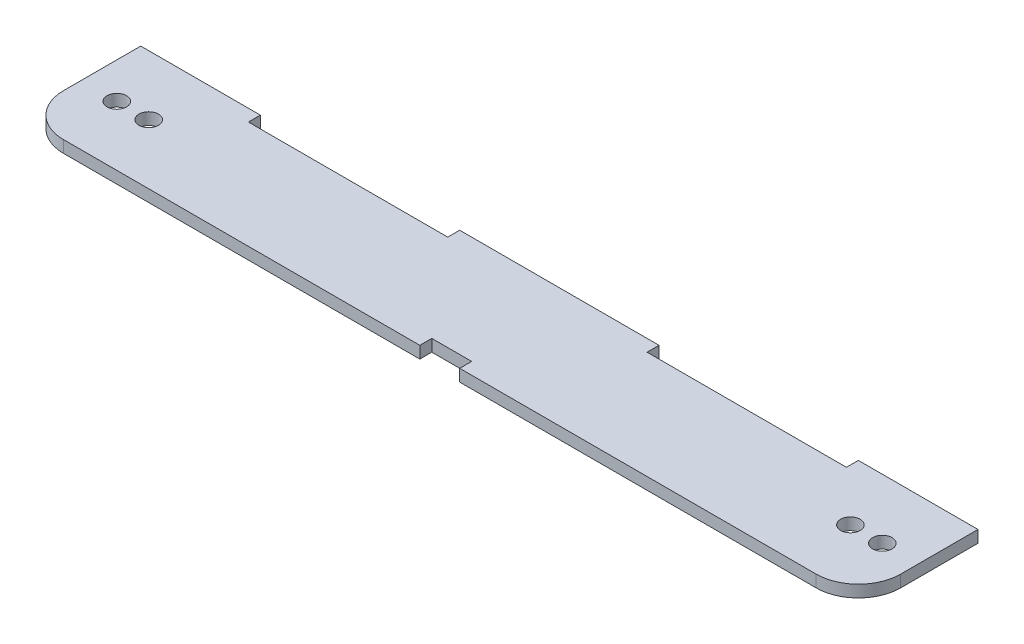
ISO-10303-21;
HEADER;
FILE_DESCRIPTION(('STEP AP214'),'2;1');
FILE_NAME('part.step','',(''),(''),'','','');
FILE_SCHEMA(('AUTOMOTIVE_DESIGN { 1 0 10303 214 1 1 1 1 }'));
ENDSEC;
DATA;
#1=APPLICATION_CONTEXT('core data for automotive mechanical design processes');
#2=APPLICATION_PROTOCOL_DEFINITION('international standard','automotive_design',2000,#1);
#3=PRODUCT_CONTEXT('',#1,'mechanical');
#4=PRODUCT('Part','Part','',(#3));
#5=PRODUCT_RELATED_PRODUCT_CATEGORY('part','',(#4));
#6=PRODUCT_DEFINITION_FORMATION('','',#4);
#7=PRODUCT_DEFINITION_CONTEXT('part definition',#1,'design');
#8=PRODUCT_DEFINITION('design','',#6,#7);
#9=PRODUCT_DEFINITION_SHAPE('','',#8);
#10=(LENGTH_UNIT() NAMED_UNIT(*) SI_UNIT(.MILLI.,.METRE.));
#11=(NAMED_UNIT(*) PLANE_ANGLE_UNIT() SI_UNIT($,.RADIAN.));
#12=(NAMED_UNIT(*) SI_UNIT($,.STERADIAN.) SOLID_ANGLE_UNIT());
#13=UNCERTAINTY_MEASURE_WITH_UNIT(LENGTH_MEASURE(1.E-05),#10,'distance_accuracy_value','');
#14=(GEOMETRIC_REPRESENTATION_CONTEXT(3) GLOBAL_UNCERTAINTY_ASSIGNED_CONTEXT((#13)) GLOBAL_UNIT_ASSIGNED_CONTEXT((#10,
#11,#12)) REPRESENTATION_CONTEXT('',''));
#15=CARTESIAN_POINT('',(0.,0.,0.));
#16=DIRECTION('',(0.,0.,1.));
#17=DIRECTION('',(1.,0.,0.));
#18=AXIS2_PLACEMENT_3D('',#15,#16,#17);
#19=CARTESIAN_POINT('',(105.,3.,15.));
#20=DIRECTION('',(0.,0.,-1.));
#21=DIRECTION('',(-1.,0.,0.));
#22=AXIS2_PLACEMENT_3D('',#19,#20,#21);
#23=PLANE('',#22);
#24=DIRECTION('',(0.,-1.,0.));
#25=VECTOR('',#24,1.);
#26=CARTESIAN_POINT('',(94.3933982822018,3.,15.));
#27=LINE('',#26,#25);
#28=CARTESIAN_POINT('',(94.3933982822018,3.,15.));
#29=VERTEX_POINT('',#28);
#30=CARTESIAN_POINT('',(94.3933982822018,0.,15.));
#31=VERTEX_POINT('',#30);
#32=EDGE_CURVE('E62',#29,#31,#27,.T.);
#33=ORIENTED_EDGE('',*,*,#32,.F.);
#34=DIRECTION('',(1.,0.,0.));
#35=VECTOR('',#34,1.);
#36=CARTESIAN_POINT('',(105.,3.,15.));
#37=LINE('',#36,#35);
#38=CARTESIAN_POINT('',(5.,3.,15.));
#39=VERTEX_POINT('',#38);
#40=EDGE_CURVE('E236',#39,#29,#37,.T.);
#41=ORIENTED_EDGE('',*,*,#40,.F.);
#42=DIRECTION('',(0.,-1.,0.));
#43=VECTOR('',#42,1.);
#44=CARTESIAN_POINT('',(5.,3.,15.));
#45=LINE('',#44,#43);
#46=CARTESIAN_POINT('',(5.,0.,15.));
#47=VERTEX_POINT('',#46);
#48=EDGE_CURVE('E206',#39,#47,#45,.T.);
#49=ORIENTED_EDGE('',*,*,#48,.T.);
#50=DIRECTION('',(1.,0.,0.));
#51=VECTOR('',#50,1.);
#52=CARTESIAN_POINT('',(105.,0.,15.));
#53=LINE('',#52,#51);
#54=EDGE_CURVE('E250',#47,#31,#53,.T.);
#55=ORIENTED_EDGE('',*,*,#54,.T.);
#56=EDGE_LOOP('',(#33,#41,#49,#55));
#57=FACE_BOUND('',#56,.T.);
#58=ADVANCED_FACE('F39',(#57),#23,.F.);
#59=DIRECTION('',(0.,-1.,0.));
#60=VECTOR('',#59,1.);
#61=CARTESIAN_POINT('',(-94.3933982822018,3.,15.));
#62=LINE('',#61,#60);
#63=CARTESIAN_POINT('',(-94.3933982822018,3.,15.));
#64=VERTEX_POINT('',#63);
#65=CARTESIAN_POINT('',(-94.3933982822018,0.,15.));
#66=VERTEX_POINT('',#65);
#67=EDGE_CURVE('E77',#64,#66,#62,.T.);
#68=ORIENTED_EDGE('',*,*,#67,.T.);
#69=CARTESIAN_POINT('',(-5.,0.,15.));
#70=VERTEX_POINT('',#69);
#71=EDGE_CURVE('E253',#66,#70,#53,.T.);
#72=ORIENTED_EDGE('',*,*,#71,.T.);
#73=DIRECTION('',(0.,-1.,0.));
#74=VECTOR('',#73,1.);
#75=CARTESIAN_POINT('',(-5.,3.,15.));
#76=LINE('',#75,#74);
#77=CARTESIAN_POINT('',(-5.,3.,15.));
#78=VERTEX_POINT('',#77);
#79=EDGE_CURVE('E335',#78,#70,#76,.T.);
#80=ORIENTED_EDGE('',*,*,#79,.F.);
#81=EDGE_CURVE('E238',#64,#78,#37,.T.);
#82=ORIENTED_EDGE('',*,*,#81,.F.);
#83=EDGE_LOOP('',(#68,#72,#80,#82));
#84=FACE_BOUND('',#83,.T.);
#85=ADVANCED_FACE('F356',(#84),#23,.F.);
#86=CARTESIAN_POINT('',(0.,3.,0.));
#87=DIRECTION('',(0.,1.,0.));
#88=DIRECTION('',(0.,0.,1.));
#89=AXIS2_PLACEMENT_3D('',#86,#87,#88);
#90=PLANE('',#89);
#91=CARTESIAN_POINT('',(-94.3933982822018,3.,4.39339828220181));
#92=DIRECTION('',(0.,1.,0.));
#93=DIRECTION('',(0.,0.,1.));
#94=AXIS2_PLACEMENT_3D('',#91,#92,#93);
#95=CIRCLE('',#94,10.6066017177982);
#96=CARTESIAN_POINT('',(-105.,3.,4.39339828220181));
#97=VERTEX_POINT('',#96);
#98=EDGE_CURVE('E312',#97,#64,#95,.T.);
#99=ORIENTED_EDGE('',*,*,#98,.T.);
#100=ORIENTED_EDGE('',*,*,#81,.T.);
#101=DIRECTION('',(0.,0.,-1.));
#102=VECTOR('',#101,1.);
#103=CARTESIAN_POINT('',(-5.,3.,12.));
#104=LINE('',#103,#102);
#105=CARTESIAN_POINT('',(-5.,3.,12.));
#106=VERTEX_POINT('',#105);
#107=EDGE_CURVE('E286',#78,#106,#104,.T.);
#108=ORIENTED_EDGE('',*,*,#107,.T.);
#109=DIRECTION('',(1.,0.,0.));
#110=VECTOR('',#109,1.);
#111=CARTESIAN_POINT('',(5.,3.,12.));
#112=LINE('',#111,#110);
#113=CARTESIAN_POINT('',(5.,3.,12.));
#114=VERTEX_POINT('',#113);
#115=EDGE_CURVE('E330',#106,#114,#112,.T.);
#116=ORIENTED_EDGE('',*,*,#115,.T.);
#117=DIRECTION('',(0.,0.,1.));
#118=VECTOR('',#117,1.);
#119=CARTESIAN_POINT('',(5.,3.,15.));
#120=LINE('',#119,#118);
#121=EDGE_CURVE('E333',#114,#39,#120,.T.);
#122=ORIENTED_EDGE('',*,*,#121,.T.);
#123=ORIENTED_EDGE('',*,*,#40,.T.);
#124=CARTESIAN_POINT('',(94.3933982822018,3.,4.39339828220175));
#125=DIRECTION('',(0.,-1.,0.));
#126=DIRECTION('',(0.,0.,-1.));
#127=AXIS2_PLACEMENT_3D('',#124,#125,#126);
#128=CIRCLE('',#127,10.6066017177982);
#129=CARTESIAN_POINT('',(105.,3.,4.39339828220174));
#130=VERTEX_POINT('',#129);
#131=EDGE_CURVE('E309',#130,#29,#128,.T.);
#132=ORIENTED_EDGE('',*,*,#131,.F.);
#133=DIRECTION('',(0.,0.,-1.));
#134=VECTOR('',#133,1.);
#135=CARTESIAN_POINT('',(105.,3.,15.));
#136=LINE('',#135,#134);
#137=CARTESIAN_POINT('',(105.,3.,-15.));
#138=VERTEX_POINT('',#137);
#139=EDGE_CURVE('E240',#130,#138,#136,.T.);
#140=ORIENTED_EDGE('',*,*,#139,.T.);
#141=DIRECTION('',(-1.,0.,0.));
#142=VECTOR('',#141,1.);
#143=CARTESIAN_POINT('',(105.,3.,-15.));
#144=LINE('',#143,#142);
#145=CARTESIAN_POINT('',(75.,3.,-15.));
#146=VERTEX_POINT('',#145);
#147=EDGE_CURVE('E243',#138,#146,#144,.T.);
#148=ORIENTED_EDGE('',*,*,#147,.T.);
#149=DIRECTION('',(0.,0.,-1.));
#150=VECTOR('',#149,1.);
#151=CARTESIAN_POINT('',(75.,3.,0.));
#152=LINE('',#151,#150);
#153=CARTESIAN_POINT('',(75.,3.,-12.));
#154=VERTEX_POINT('',#153);
#155=EDGE_CURVE('E225',#154,#146,#152,.T.);
#156=ORIENTED_EDGE('',*,*,#155,.F.);
#157=DIRECTION('',(1.,0.,0.));
#158=VECTOR('',#157,1.);
#159=CARTESIAN_POINT('',(0.,3.,-12.));
#160=LINE('',#159,#158);
#161=CARTESIAN_POINT('',(25.,3.,-12.));
#162=VERTEX_POINT('',#161);
#163=EDGE_CURVE('E223',#162,#154,#160,.T.);
#164=ORIENTED_EDGE('',*,*,#163,.F.);
#165=DIRECTION('',(0.,0.,1.));
#166=VECTOR('',#165,1.);
#167=CARTESIAN_POINT('',(25.,3.,0.));
#168=LINE('',#167,#166);
#169=CARTESIAN_POINT('',(25.,3.,-15.));
#170=VERTEX_POINT('',#169);
#171=EDGE_CURVE('E199',#170,#162,#168,.T.);
#172=ORIENTED_EDGE('',*,*,#171,.F.);
#173=CARTESIAN_POINT('',(-25.,3.,-15.));
#174=VERTEX_POINT('',#173);
#175=EDGE_CURVE('E247',#170,#174,#144,.T.);
#176=ORIENTED_EDGE('',*,*,#175,.T.);
#177=DIRECTION('',(0.,0.,-1.));
#178=VECTOR('',#177,1.);
#179=CARTESIAN_POINT('',(-25.,3.,0.));
#180=LINE('',#179,#178);
#181=CARTESIAN_POINT('',(-25.,3.,-12.));
#182=VERTEX_POINT('',#181);
#183=EDGE_CURVE('E228',#182,#174,#180,.T.);
#184=ORIENTED_EDGE('',*,*,#183,.F.);
#185=DIRECTION('',(1.,0.,0.));
#186=VECTOR('',#185,1.);
#187=CARTESIAN_POINT('',(0.,3.,-12.));
#188=LINE('',#187,#186);
#189=CARTESIAN_POINT('',(-75.,3.,-12.));
#190=VERTEX_POINT('',#189);
#191=EDGE_CURVE('E186',#190,#182,#188,.T.);
#192=ORIENTED_EDGE('',*,*,#191,.F.);
#193=DIRECTION('',(0.,0.,1.));
#194=VECTOR('',#193,1.);
#195=CARTESIAN_POINT('',(-75.,3.,0.));
#196=LINE('',#195,#194);
#197=CARTESIAN_POINT('',(-75.,3.,-15.));
#198=VERTEX_POINT('',#197);
#199=EDGE_CURVE('E230',#198,#190,#196,.T.);
#200=ORIENTED_EDGE('',*,*,#199,.F.);
#201=CARTESIAN_POINT('',(-105.,3.,-15.));
#202=VERTEX_POINT('',#201);
#203=EDGE_CURVE('E242',#198,#202,#144,.T.);
#204=ORIENTED_EDGE('',*,*,#203,.T.);
#205=DIRECTION('',(0.,0.,1.));
#206=VECTOR('',#205,1.);
#207=CARTESIAN_POINT('',(-105.,3.,15.));
#208=LINE('',#207,#206);
#209=EDGE_CURVE('E233',#202,#97,#208,.T.);
#210=ORIENTED_EDGE('',*,*,#209,.T.);
#211=EDGE_LOOP('',(#99,#100,#108,#116,#122,#123,#132,#140,#148,#156,#164,#172,#176,#184,#192,
#200,#204,#210));
#212=FACE_BOUND('',#211,.T.);
#213=CARTESIAN_POINT('',(96.,3.,0.));
#214=DIRECTION('',(0.,1.,0.));
#215=DIRECTION('',(0.,0.,-1.));
#216=AXIS2_PLACEMENT_3D('',#213,#214,#215);
#217=CIRCLE('',#216,2.45);
#218=CARTESIAN_POINT('',(96.,3.,2.44999999999992));
#219=VERTEX_POINT('',#218);
#220=EDGE_CURVE('E323',#219,#219,#217,.T.);
#221=ORIENTED_EDGE('',*,*,#220,.F.);
#222=EDGE_LOOP('',(#221));
#223=FACE_BOUND('',#222,.T.);
#224=CARTESIAN_POINT('',(88.,3.,0.));
#225=DIRECTION('',(0.,1.,0.));
#226=DIRECTION('',(0.,0.,1.));
#227=AXIS2_PLACEMENT_3D('',#224,#225,#226);
#228=CIRCLE('',#227,2.45);
#229=CARTESIAN_POINT('',(88.,3.,2.44999999999993));
#230=VERTEX_POINT('',#229);
#231=EDGE_CURVE('E320',#230,#230,#228,.T.);
#232=ORIENTED_EDGE('',*,*,#231,.F.);
#233=EDGE_LOOP('',(#232));
#234=FACE_BOUND('',#233,.T.);
#235=CARTESIAN_POINT('',(-96.,3.,0.));
#236=DIRECTION('',(0.,1.,0.));
#237=DIRECTION('',(0.,0.,1.));
#238=AXIS2_PLACEMENT_3D('',#235,#236,#237);
#239=CIRCLE('',#238,2.45);
#240=CARTESIAN_POINT('',(-96.,3.,2.45));
#241=VERTEX_POINT('',#240);
#242=EDGE_CURVE('E317',#241,#241,#239,.T.);
#243=ORIENTED_EDGE('',*,*,#242,.F.);
#244=EDGE_LOOP('',(#243));
#245=FACE_BOUND('',#244,.T.);
#246=CARTESIAN_POINT('',(-88.,3.,0.));
#247=DIRECTION('',(0.,1.,0.));
#248=DIRECTION('',(0.,0.,-1.));
#249=AXIS2_PLACEMENT_3D('',#246,#247,#248);
#250=CIRCLE('',#249,2.45);
#251=CARTESIAN_POINT('',(-88.,3.,2.45));
#252=VERTEX_POINT('',#251);
#253=EDGE_CURVE('E278',#252,#252,#250,.T.);
#254=ORIENTED_EDGE('',*,*,#253,.F.);
#255=EDGE_LOOP('',(#254));
#256=FACE_BOUND('',#255,.T.);
#257=ADVANCED_FACE('F305',(#212,#223,#234,#245,#256),#90,.T.);
#258=CARTESIAN_POINT('',(0.,0.,0.));
#259=DIRECTION('',(0.,1.,0.));
#260=DIRECTION('',(0.,0.,1.));
#261=AXIS2_PLACEMENT_3D('',#258,#259,#260);
#262=PLANE('',#261);
#263=CARTESIAN_POINT('',(-88.,0.,0.));
#264=DIRECTION('',(0.,1.,0.));
#265=DIRECTION('',(0.,0.,1.));
#266=AXIS2_PLACEMENT_3D('',#263,#264,#265);
#267=CIRCLE('',#266,2.45);
#268=CARTESIAN_POINT('',(-88.,0.,2.45));
#269=VERTEX_POINT('',#268);
#270=EDGE_CURVE('E274',#269,#269,#267,.T.);
#271=ORIENTED_EDGE('',*,*,#270,.T.);
#272=EDGE_LOOP('',(#271));
#273=FACE_BOUND('',#272,.T.);
#274=CARTESIAN_POINT('',(-96.,0.,0.));
#275=DIRECTION('',(0.,1.,0.));
#276=DIRECTION('',(0.,0.,1.));
#277=AXIS2_PLACEMENT_3D('',#274,#275,#276);
#278=CIRCLE('',#277,2.45);
#279=CARTESIAN_POINT('',(-96.,0.,2.45));
#280=VERTEX_POINT('',#279);
#281=EDGE_CURVE('E277',#280,#280,#278,.T.);
#282=ORIENTED_EDGE('',*,*,#281,.T.);
#283=EDGE_LOOP('',(#282));
#284=FACE_BOUND('',#283,.T.);
#285=CARTESIAN_POINT('',(88.,0.,0.));
#286=DIRECTION('',(0.,1.,0.));
#287=DIRECTION('',(0.,0.,1.));
#288=AXIS2_PLACEMENT_3D('',#285,#286,#287);
#289=CIRCLE('',#288,2.45);
#290=CARTESIAN_POINT('',(88.,0.,2.44999999999993));
#291=VERTEX_POINT('',#290);
#292=EDGE_CURVE('E281',#291,#291,#289,.T.);
#293=ORIENTED_EDGE('',*,*,#292,.T.);
#294=EDGE_LOOP('',(#293));
#295=FACE_BOUND('',#294,.T.);
#296=CARTESIAN_POINT('',(96.,0.,0.));
#297=DIRECTION('',(0.,1.,0.));
#298=DIRECTION('',(0.,0.,1.));
#299=AXIS2_PLACEMENT_3D('',#296,#297,#298);
#300=CIRCLE('',#299,2.45);
#301=CARTESIAN_POINT('',(96.,0.,2.44999999999992));
#302=VERTEX_POINT('',#301);
#303=EDGE_CURVE('E284',#302,#302,#300,.T.);
#304=ORIENTED_EDGE('',*,*,#303,.T.);
#305=EDGE_LOOP('',(#304));
#306=FACE_BOUND('',#305,.T.);
#307=ORIENTED_EDGE('',*,*,#71,.F.);
#308=CARTESIAN_POINT('',(-94.3933982822018,0.,4.39339828220181));
#309=DIRECTION('',(0.,-1.,0.));
#310=DIRECTION('',(0.,0.,-1.));
#311=AXIS2_PLACEMENT_3D('',#308,#309,#310);
#312=CIRCLE('',#311,10.6066017177982);
#313=CARTESIAN_POINT('',(-105.,0.,4.39339828220181));
#314=VERTEX_POINT('',#313);
#315=EDGE_CURVE('E11',#66,#314,#312,.T.);
#316=ORIENTED_EDGE('',*,*,#315,.T.);
#317=DIRECTION('',(0.,0.,1.));
#318=VECTOR('',#317,1.);
#319=CARTESIAN_POINT('',(-105.,0.,15.));
#320=LINE('',#319,#318);
#321=CARTESIAN_POINT('',(-105.,0.,-15.));
#322=VERTEX_POINT('',#321);
#323=EDGE_CURVE('E232',#322,#314,#320,.T.);
#324=ORIENTED_EDGE('',*,*,#323,.F.);
#325=DIRECTION('',(-1.,0.,0.));
#326=VECTOR('',#325,1.);
#327=CARTESIAN_POINT('',(105.,0.,-15.));
#328=LINE('',#327,#326);
#329=CARTESIAN_POINT('',(-75.,0.,-15.));
#330=VERTEX_POINT('',#329);
#331=EDGE_CURVE('E256',#330,#322,#328,.T.);
#332=ORIENTED_EDGE('',*,*,#331,.F.);
#333=DIRECTION('',(0.,0.,1.));
#334=VECTOR('',#333,1.);
#335=CARTESIAN_POINT('',(-75.,0.,-15.));
#336=LINE('',#335,#334);
#337=CARTESIAN_POINT('',(-75.,0.,-12.));
#338=VERTEX_POINT('',#337);
#339=EDGE_CURVE('E191',#330,#338,#336,.T.);
#340=ORIENTED_EDGE('',*,*,#339,.T.);
#341=DIRECTION('',(1.,0.,0.));
#342=VECTOR('',#341,1.);
#343=CARTESIAN_POINT('',(-75.,0.,-12.));
#344=LINE('',#343,#342);
#345=CARTESIAN_POINT('',(-25.,0.,-12.));
#346=VERTEX_POINT('',#345);
#347=EDGE_CURVE('E178',#338,#346,#344,.T.);
#348=ORIENTED_EDGE('',*,*,#347,.T.);
#349=DIRECTION('',(0.,0.,-1.));
#350=VECTOR('',#349,1.);
#351=CARTESIAN_POINT('',(-25.,0.,-15.));
#352=LINE('',#351,#350);
#353=CARTESIAN_POINT('',(-25.,0.,-15.));
#354=VERTEX_POINT('',#353);
#355=EDGE_CURVE('E166',#346,#354,#352,.T.);
#356=ORIENTED_EDGE('',*,*,#355,.T.);
#357=CARTESIAN_POINT('',(25.,0.,-15.));
#358=VERTEX_POINT('',#357);
#359=EDGE_CURVE('E259',#358,#354,#328,.T.);
#360=ORIENTED_EDGE('',*,*,#359,.F.);
#361=DIRECTION('',(0.,0.,1.));
#362=VECTOR('',#361,1.);
#363=CARTESIAN_POINT('',(25.,0.,-15.));
#364=LINE('',#363,#362);
#365=CARTESIAN_POINT('',(25.,0.,-12.));
#366=VERTEX_POINT('',#365);
#367=EDGE_CURVE('E205',#358,#366,#364,.T.);
#368=ORIENTED_EDGE('',*,*,#367,.T.);
#369=DIRECTION('',(1.,0.,0.));
#370=VECTOR('',#369,1.);
#371=CARTESIAN_POINT('',(25.,0.,-12.));
#372=LINE('',#371,#370);
#373=CARTESIAN_POINT('',(75.,0.,-12.));
#374=VERTEX_POINT('',#373);
#375=EDGE_CURVE('E209',#366,#374,#372,.T.);
#376=ORIENTED_EDGE('',*,*,#375,.T.);
#377=DIRECTION('',(0.,0.,-1.));
#378=VECTOR('',#377,1.);
#379=CARTESIAN_POINT('',(75.,0.,-15.));
#380=LINE('',#379,#378);
#381=CARTESIAN_POINT('',(75.,0.,-15.));
#382=VERTEX_POINT('',#381);
#383=EDGE_CURVE('E202',#374,#382,#380,.T.);
#384=ORIENTED_EDGE('',*,*,#383,.T.);
#385=CARTESIAN_POINT('',(105.,0.,-15.));
#386=VERTEX_POINT('',#385);
#387=EDGE_CURVE('E237',#386,#382,#328,.T.);
#388=ORIENTED_EDGE('',*,*,#387,.F.);
#389=DIRECTION('',(0.,0.,-1.));
#390=VECTOR('',#389,1.);
#391=CARTESIAN_POINT('',(105.,0.,15.));
#392=LINE('',#391,#390);
#393=CARTESIAN_POINT('',(105.,0.,4.39339828220175));
#394=VERTEX_POINT('',#393);
#395=EDGE_CURVE('E254',#394,#386,#392,.T.);
#396=ORIENTED_EDGE('',*,*,#395,.F.);
#397=CARTESIAN_POINT('',(94.3933982822018,0.,4.39339828220175));
#398=DIRECTION('',(0.,-1.,0.));
#399=DIRECTION('',(0.,0.,-1.));
#400=AXIS2_PLACEMENT_3D('',#397,#398,#399);
#401=CIRCLE('',#400,10.6066017177982);
#402=EDGE_CURVE('E47',#31,#394,#401,.F.);
#403=ORIENTED_EDGE('',*,*,#402,.F.);
#404=ORIENTED_EDGE('',*,*,#54,.F.);
#405=DIRECTION('',(0.,0.,-1.));
#406=VECTOR('',#405,1.);
#407=CARTESIAN_POINT('',(5.,0.,0.));
#408=LINE('',#407,#406);
#409=CARTESIAN_POINT('',(5.,0.,12.));
#410=VERTEX_POINT('',#409);
#411=EDGE_CURVE('E271',#47,#410,#408,.T.);
#412=ORIENTED_EDGE('',*,*,#411,.T.);
#413=DIRECTION('',(-1.,0.,0.));
#414=VECTOR('',#413,1.);
#415=CARTESIAN_POINT('',(0.,0.,12.));
#416=LINE('',#415,#414);
#417=CARTESIAN_POINT('',(-5.,0.,12.));
#418=VERTEX_POINT('',#417);
#419=EDGE_CURVE('E268',#410,#418,#416,.T.);
#420=ORIENTED_EDGE('',*,*,#419,.T.);
#421=DIRECTION('',(0.,0.,1.));
#422=VECTOR('',#421,1.);
#423=CARTESIAN_POINT('',(-5.,0.,0.));
#424=LINE('',#423,#422);
#425=EDGE_CURVE('E265',#418,#70,#424,.T.);
#426=ORIENTED_EDGE('',*,*,#425,.T.);
#427=EDGE_LOOP('',(#307,#316,#324,#332,#340,#348,#356,#360,#368,#376,#384,#388,#396,#403,#404,
#412,#420,#426));
#428=FACE_BOUND('',#427,.T.);
#429=ADVANCED_FACE('F189',(#273,#284,#295,#306,#428),#262,.F.);
#430=CARTESIAN_POINT('',(105.,3.,-15.));
#431=DIRECTION('',(0.,0.,1.));
#432=DIRECTION('',(1.,0.,0.));
#433=AXIS2_PLACEMENT_3D('',#430,#431,#432);
#434=PLANE('',#433);
#435=ORIENTED_EDGE('',*,*,#203,.F.);
#436=DIRECTION('',(0.,1.,0.));
#437=VECTOR('',#436,1.);
#438=CARTESIAN_POINT('',(-75.,0.,-15.));
#439=LINE('',#438,#437);
#440=EDGE_CURVE('E197',#330,#198,#439,.T.);
#441=ORIENTED_EDGE('',*,*,#440,.F.);
#442=ORIENTED_EDGE('',*,*,#331,.T.);
#443=DIRECTION('',(0.,-1.,0.));
#444=VECTOR('',#443,1.);
#445=CARTESIAN_POINT('',(-105.,3.,-15.));
#446=LINE('',#445,#444);
#447=EDGE_CURVE('E246',#202,#322,#446,.T.);
#448=ORIENTED_EDGE('',*,*,#447,.F.);
#449=EDGE_LOOP('',(#435,#441,#442,#448));
#450=FACE_BOUND('',#449,.T.);
#451=ADVANCED_FACE('F374',(#450),#434,.F.);
#452=ORIENTED_EDGE('',*,*,#387,.T.);
#453=DIRECTION('',(0.,1.,0.));
#454=VECTOR('',#453,1.);
#455=CARTESIAN_POINT('',(75.,0.,-15.));
#456=LINE('',#455,#454);
#457=EDGE_CURVE('E212',#382,#146,#456,.T.);
#458=ORIENTED_EDGE('',*,*,#457,.T.);
#459=ORIENTED_EDGE('',*,*,#147,.F.);
#460=DIRECTION('',(0.,-1.,0.));
#461=VECTOR('',#460,1.);
#462=CARTESIAN_POINT('',(105.,3.,-15.));
#463=LINE('',#462,#461);
#464=EDGE_CURVE('E262',#138,#386,#463,.T.);
#465=ORIENTED_EDGE('',*,*,#464,.T.);
#466=EDGE_LOOP('',(#452,#458,#459,#465));
#467=FACE_BOUND('',#466,.T.);
#468=ADVANCED_FACE('F301',(#467),#434,.F.);
#469=CARTESIAN_POINT('',(-105.,3.,15.));
#470=DIRECTION('',(1.,0.,0.));
#471=DIRECTION('',(0.,0.,-1.));
#472=AXIS2_PLACEMENT_3D('',#469,#470,#471);
#473=PLANE('',#472);
#474=ORIENTED_EDGE('',*,*,#323,.T.);
#475=DIRECTION('',(0.,-1.,0.));
#476=VECTOR('',#475,1.);
#477=CARTESIAN_POINT('',(-105.,3.,4.39339828220181));
#478=LINE('',#477,#476);
#479=EDGE_CURVE('E54',#97,#314,#478,.T.);
#480=ORIENTED_EDGE('',*,*,#479,.F.);
#481=ORIENTED_EDGE('',*,*,#209,.F.);
#482=ORIENTED_EDGE('',*,*,#447,.T.);
#483=EDGE_LOOP('',(#474,#480,#481,#482));
#484=FACE_BOUND('',#483,.T.);
#485=ADVANCED_FACE('F41',(#484),#473,.F.);
#486=CARTESIAN_POINT('',(105.,3.,15.));
#487=DIRECTION('',(-1.,0.,0.));
#488=DIRECTION('',(0.,0.,1.));
#489=AXIS2_PLACEMENT_3D('',#486,#487,#488);
#490=PLANE('',#489);
#491=ORIENTED_EDGE('',*,*,#139,.F.);
#492=DIRECTION('',(0.,-1.,0.));
#493=VECTOR('',#492,1.);
#494=CARTESIAN_POINT('',(105.,3.,4.39339828220174));
#495=LINE('',#494,#493);
#496=EDGE_CURVE('E289',#130,#394,#495,.T.);
#497=ORIENTED_EDGE('',*,*,#496,.T.);
#498=ORIENTED_EDGE('',*,*,#395,.T.);
#499=ORIENTED_EDGE('',*,*,#464,.F.);
#500=EDGE_LOOP('',(#491,#497,#498,#499));
#501=FACE_BOUND('',#500,.T.);
#502=ADVANCED_FACE('F295',(#501),#490,.F.);
#503=ORIENTED_EDGE('',*,*,#359,.T.);
#504=DIRECTION('',(0.,1.,0.));
#505=VECTOR('',#504,1.);
#506=CARTESIAN_POINT('',(-25.,0.,-15.));
#507=LINE('',#506,#505);
#508=EDGE_CURVE('E172',#354,#174,#507,.T.);
#509=ORIENTED_EDGE('',*,*,#508,.T.);
#510=ORIENTED_EDGE('',*,*,#175,.F.);
#511=DIRECTION('',(0.,1.,0.));
#512=VECTOR('',#511,1.);
#513=CARTESIAN_POINT('',(25.,0.,-15.));
#514=LINE('',#513,#512);
#515=EDGE_CURVE('E218',#358,#170,#514,.T.);
#516=ORIENTED_EDGE('',*,*,#515,.F.);
#517=EDGE_LOOP('',(#503,#509,#510,#516));
#518=FACE_BOUND('',#517,.T.);
#519=ADVANCED_FACE('F369',(#518),#434,.F.);
#520=CARTESIAN_POINT('',(75.,0.,-15.));
#521=DIRECTION('',(1.,0.,0.));
#522=DIRECTION('',(0.,0.,-1.));
#523=AXIS2_PLACEMENT_3D('',#520,#521,#522);
#524=PLANE('',#523);
#525=ORIENTED_EDGE('',*,*,#155,.T.);
#526=ORIENTED_EDGE('',*,*,#457,.F.);
#527=ORIENTED_EDGE('',*,*,#383,.F.);
#528=DIRECTION('',(0.,1.,0.));
#529=VECTOR('',#528,1.);
#530=CARTESIAN_POINT('',(75.,0.,-12.));
#531=LINE('',#530,#529);
#532=EDGE_CURVE('E193',#374,#154,#531,.T.);
#533=ORIENTED_EDGE('',*,*,#532,.T.);
#534=EDGE_LOOP('',(#525,#526,#527,#533));
#535=FACE_BOUND('',#534,.T.);
#536=ADVANCED_FACE('F372',(#535),#524,.F.);
#537=CARTESIAN_POINT('',(25.,0.,-12.));
#538=DIRECTION('',(0.,0.,1.));
#539=DIRECTION('',(1.,0.,0.));
#540=AXIS2_PLACEMENT_3D('',#537,#538,#539);
#541=PLANE('',#540);
#542=ORIENTED_EDGE('',*,*,#163,.T.);
#543=ORIENTED_EDGE('',*,*,#532,.F.);
#544=ORIENTED_EDGE('',*,*,#375,.F.);
#545=DIRECTION('',(0.,1.,0.));
#546=VECTOR('',#545,1.);
#547=CARTESIAN_POINT('',(25.,0.,-12.));
#548=LINE('',#547,#546);
#549=EDGE_CURVE('E215',#366,#162,#548,.T.);
#550=ORIENTED_EDGE('',*,*,#549,.T.);
#551=EDGE_LOOP('',(#542,#543,#544,#550));
#552=FACE_BOUND('',#551,.T.);
#553=ADVANCED_FACE('F380',(#552),#541,.F.);
#554=CARTESIAN_POINT('',(25.,0.,-15.));
#555=DIRECTION('',(-1.,0.,0.));
#556=DIRECTION('',(0.,0.,1.));
#557=AXIS2_PLACEMENT_3D('',#554,#555,#556);
#558=PLANE('',#557);
#559=ORIENTED_EDGE('',*,*,#171,.T.);
#560=ORIENTED_EDGE('',*,*,#549,.F.);
#561=ORIENTED_EDGE('',*,*,#367,.F.);
#562=ORIENTED_EDGE('',*,*,#515,.T.);
#563=EDGE_LOOP('',(#559,#560,#561,#562));
#564=FACE_BOUND('',#563,.T.);
#565=ADVANCED_FACE('F382',(#564),#558,.F.);
#566=CARTESIAN_POINT('',(-75.,0.,-15.));
#567=DIRECTION('',(-1.,0.,0.));
#568=DIRECTION('',(0.,0.,1.));
#569=AXIS2_PLACEMENT_3D('',#566,#567,#568);
#570=PLANE('',#569);
#571=ORIENTED_EDGE('',*,*,#199,.T.);
#572=DIRECTION('',(0.,1.,0.));
#573=VECTOR('',#572,1.);
#574=CARTESIAN_POINT('',(-75.,0.,-12.));
#575=LINE('',#574,#573);
#576=EDGE_CURVE('E177',#338,#190,#575,.T.);
#577=ORIENTED_EDGE('',*,*,#576,.F.);
#578=ORIENTED_EDGE('',*,*,#339,.F.);
#579=ORIENTED_EDGE('',*,*,#440,.T.);
#580=EDGE_LOOP('',(#571,#577,#578,#579));
#581=FACE_BOUND('',#580,.T.);
#582=ADVANCED_FACE('F385',(#581),#570,.F.);
#583=CARTESIAN_POINT('',(-25.,0.,-15.));
#584=DIRECTION('',(1.,0.,0.));
#585=DIRECTION('',(0.,0.,-1.));
#586=AXIS2_PLACEMENT_3D('',#583,#584,#585);
#587=PLANE('',#586);
#588=ORIENTED_EDGE('',*,*,#183,.T.);
#589=ORIENTED_EDGE('',*,*,#508,.F.);
#590=ORIENTED_EDGE('',*,*,#355,.F.);
#591=DIRECTION('',(0.,1.,0.));
#592=VECTOR('',#591,1.);
#593=CARTESIAN_POINT('',(-25.,0.,-12.));
#594=LINE('',#593,#592);
#595=EDGE_CURVE('E169',#346,#182,#594,.T.);
#596=ORIENTED_EDGE('',*,*,#595,.T.);
#597=EDGE_LOOP('',(#588,#589,#590,#596));
#598=FACE_BOUND('',#597,.T.);
#599=ADVANCED_FACE('F168',(#598),#587,.F.);
#600=CARTESIAN_POINT('',(-75.,0.,-12.));
#601=DIRECTION('',(0.,0.,1.));
#602=DIRECTION('',(1.,0.,0.));
#603=AXIS2_PLACEMENT_3D('',#600,#601,#602);
#604=PLANE('',#603);
#605=ORIENTED_EDGE('',*,*,#191,.T.);
#606=ORIENTED_EDGE('',*,*,#595,.F.);
#607=ORIENTED_EDGE('',*,*,#347,.F.);
#608=ORIENTED_EDGE('',*,*,#576,.T.);
#609=EDGE_LOOP('',(#605,#606,#607,#608));
#610=FACE_BOUND('',#609,.T.);
#611=ADVANCED_FACE('F182',(#610),#604,.F.);
#612=CARTESIAN_POINT('',(5.,3.,15.));
#613=DIRECTION('',(1.,0.,0.));
#614=DIRECTION('',(0.,0.,-1.));
#615=AXIS2_PLACEMENT_3D('',#612,#613,#614);
#616=PLANE('',#615);
#617=ORIENTED_EDGE('',*,*,#48,.F.);
#618=ORIENTED_EDGE('',*,*,#121,.F.);
#619=DIRECTION('',(0.,-1.,0.));
#620=VECTOR('',#619,1.);
#621=CARTESIAN_POINT('',(5.,3.,12.));
#622=LINE('',#621,#620);
#623=EDGE_CURVE('E338',#114,#410,#622,.T.);
#624=ORIENTED_EDGE('',*,*,#623,.T.);
#625=ORIENTED_EDGE('',*,*,#411,.F.);
#626=EDGE_LOOP('',(#617,#618,#624,#625));
#627=FACE_BOUND('',#626,.T.);
#628=ADVANCED_FACE('F355',(#627),#616,.F.);
#629=CARTESIAN_POINT('',(5.,3.,12.));
#630=DIRECTION('',(0.,0.,-1.));
#631=DIRECTION('',(-1.,0.,0.));
#632=AXIS2_PLACEMENT_3D('',#629,#630,#631);
#633=PLANE('',#632);
#634=ORIENTED_EDGE('',*,*,#623,.F.);
#635=ORIENTED_EDGE('',*,*,#115,.F.);
#636=DIRECTION('',(0.,-1.,0.));
#637=VECTOR('',#636,1.);
#638=CARTESIAN_POINT('',(-5.,3.,12.));
#639=LINE('',#638,#637);
#640=EDGE_CURVE('E341',#106,#418,#639,.T.);
#641=ORIENTED_EDGE('',*,*,#640,.T.);
#642=ORIENTED_EDGE('',*,*,#419,.F.);
#643=EDGE_LOOP('',(#634,#635,#641,#642));
#644=FACE_BOUND('',#643,.T.);
#645=ADVANCED_FACE('F351',(#644),#633,.F.);
#646=CARTESIAN_POINT('',(-5.,3.,12.));
#647=DIRECTION('',(-1.,0.,0.));
#648=DIRECTION('',(0.,0.,1.));
#649=AXIS2_PLACEMENT_3D('',#646,#647,#648);
#650=PLANE('',#649);
#651=ORIENTED_EDGE('',*,*,#640,.F.);
#652=ORIENTED_EDGE('',*,*,#107,.F.);
#653=ORIENTED_EDGE('',*,*,#79,.T.);
#654=ORIENTED_EDGE('',*,*,#425,.F.);
#655=EDGE_LOOP('',(#651,#652,#653,#654));
#656=FACE_BOUND('',#655,.T.);
#657=ADVANCED_FACE('F347',(#656),#650,.F.);
#658=CARTESIAN_POINT('',(-88.,-1.2E-05,0.));
#659=DIRECTION('',(0.,1.,0.));
#660=DIRECTION('',(0.,0.,1.));
#661=AXIS2_PLACEMENT_3D('',#658,#659,#660);
#662=CYLINDRICAL_SURFACE('',#661,2.45);
#663=CARTESIAN_POINT('',(-88.,3.,2.45));
#664=CARTESIAN_POINT('',(-88.,2.96875,2.45));
#665=CARTESIAN_POINT('',(-88.,2.9375,2.45));
#666=CARTESIAN_POINT('',(-88.,2.875,2.45));
#667=CARTESIAN_POINT('',(-88.,2.84375,2.45));
#668=CARTESIAN_POINT('',(-88.,2.78125,2.45));
#669=CARTESIAN_POINT('',(-88.,2.75,2.45));
#670=CARTESIAN_POINT('',(-88.,2.6875,2.45));
#671=CARTESIAN_POINT('',(-88.,2.65625,2.45));
#672=CARTESIAN_POINT('',(-88.,2.59375,2.45));
#673=CARTESIAN_POINT('',(-88.,2.5625,2.45));
#674=CARTESIAN_POINT('',(-88.,2.5,2.45));
#675=CARTESIAN_POINT('',(-88.,2.46875,2.45));
#676=CARTESIAN_POINT('',(-88.,2.40625,2.45));
#677=CARTESIAN_POINT('',(-88.,2.375,2.45));
#678=CARTESIAN_POINT('',(-88.,2.3125,2.45));
#679=CARTESIAN_POINT('',(-88.,2.28125,2.45));
#680=CARTESIAN_POINT('',(-88.,2.21875,2.45));
#681=CARTESIAN_POINT('',(-88.,2.1875,2.45));
#682=CARTESIAN_POINT('',(-88.,2.125,2.45));
#683=CARTESIAN_POINT('',(-88.,2.09375,2.45));
#684=CARTESIAN_POINT('',(-88.,2.03125,2.45));
#685=CARTESIAN_POINT('',(-88.,2.,2.45));
#686=CARTESIAN_POINT('',(-88.,1.9375,2.45));
#687=CARTESIAN_POINT('',(-88.,1.90625,2.45));
#688=CARTESIAN_POINT('',(-88.,1.84375,2.45));
#689=CARTESIAN_POINT('',(-88.,1.8125,2.45));
#690=CARTESIAN_POINT('',(-88.,1.75,2.45));
#691=CARTESIAN_POINT('',(-88.,1.71875,2.45));
#692=CARTESIAN_POINT('',(-88.,1.65625,2.45));
#693=CARTESIAN_POINT('',(-88.,1.625,2.45));
#694=CARTESIAN_POINT('',(-88.,1.5625,2.45));
#695=CARTESIAN_POINT('',(-88.,1.53125,2.45));
#696=CARTESIAN_POINT('',(-88.,1.46875,2.45));
#697=CARTESIAN_POINT('',(-88.,1.4375,2.45));
#698=CARTESIAN_POINT('',(-88.,1.375,2.45));
#699=CARTESIAN_POINT('',(-88.,1.34375,2.45));
#700=CARTESIAN_POINT('',(-88.,1.28125,2.45));
#701=CARTESIAN_POINT('',(-88.,1.25,2.45));
#702=CARTESIAN_POINT('',(-88.,1.1875,2.45));
#703=CARTESIAN_POINT('',(-88.,1.15625,2.45));
#704=CARTESIAN_POINT('',(-88.,1.09375,2.45));
#705=CARTESIAN_POINT('',(-88.,1.0625,2.45));
#706=CARTESIAN_POINT('',(-88.,1.,2.45));
#707=CARTESIAN_POINT('',(-88.,0.96875,2.45));
#708=CARTESIAN_POINT('',(-88.,0.90625,2.45));
#709=CARTESIAN_POINT('',(-88.,0.875,2.45));
#710=CARTESIAN_POINT('',(-88.,0.8125,2.45));
#711=CARTESIAN_POINT('',(-88.,0.78125,2.45));
#712=CARTESIAN_POINT('',(-88.,0.71875,2.45));
#713=CARTESIAN_POINT('',(-88.,0.6875,2.45));
#714=CARTESIAN_POINT('',(-88.,0.625,2.45));
#715=CARTESIAN_POINT('',(-88.,0.59375,2.45));
#716=CARTESIAN_POINT('',(-88.,0.53125,2.45));
#717=CARTESIAN_POINT('',(-88.,0.5,2.45));
#718=CARTESIAN_POINT('',(-88.,0.4375,2.45));
#719=CARTESIAN_POINT('',(-88.,0.40625,2.45));
#720=CARTESIAN_POINT('',(-88.,0.34375,2.45));
#721=CARTESIAN_POINT('',(-88.,0.3125,2.45));
#722=CARTESIAN_POINT('',(-88.,0.25,2.45));
#723=CARTESIAN_POINT('',(-88.,0.21875,2.45));
#724=CARTESIAN_POINT('',(-88.,0.15625,2.45));
#725=CARTESIAN_POINT('',(-88.,0.125,2.45));
#726=CARTESIAN_POINT('',(-88.,0.0625000000000002,2.45));
#727=CARTESIAN_POINT('',(-88.,0.0312500000000002,2.45));
#728=CARTESIAN_POINT('',(-88.,0.,2.45));
#729=B_SPLINE_CURVE_WITH_KNOTS('',3,(#663,#664,#665,#666,#667,#668,#669,#670,#671,#672,#673,
#674,#675,#676,#677,#678,#679,#680,#681,#682,#683,#684,#685,#686,#687,#688,#689,#690,#691,#692,
#693,#694,#695,#696,#697,#698,#699,#700,#701,#702,#703,#704,#705,#706,#707,#708,#709,#710,#711,
#712,#713,#714,#715,#716,#717,#718,#719,#720,#721,#722,#723,#724,#725,#726,#727,#728),
.UNSPECIFIED.,.F.,.F.,(4,2,2,2,2,2,2,2,2,2,2,2,2,2,2,2,2,2,2,2,2,2,2,2,2,2,2,2,2,2,2,2,4),(0.,
0.0937500000000001,0.1875,0.28125,0.375,0.46875,0.5625,0.65625,0.75,0.84375,0.9375,1.03125,
1.125,1.21875,1.3125,1.40625,1.5,1.59375,1.6875,1.78125,1.875,1.96875,2.0625,2.15625,2.25,
2.34375,2.4375,2.53125,2.625,2.71875,2.8125,2.90625,3.),.UNSPECIFIED.);
#730=EDGE_CURVE('BSEAM399',#252,#269,#729,.T.);
#731=ORIENTED_EDGE('',*,*,#253,.T.);
#732=ORIENTED_EDGE('',*,*,#270,.F.);
#733=ORIENTED_EDGE('',*,*,#730,.T.);
#734=ORIENTED_EDGE('',*,*,#730,.F.);
#735=EDGE_LOOP('',(#731,#733,#732,#734));
#736=FACE_BOUND('',#735,.T.);
#737=ADVANCED_FACE('F399',(#736),#662,.F.);
#738=CARTESIAN_POINT('',(-96.,-1.2E-05,0.));
#739=DIRECTION('',(0.,1.,0.));
#740=DIRECTION('',(0.,0.,1.));
#741=AXIS2_PLACEMENT_3D('',#738,#739,#740);
#742=CYLINDRICAL_SURFACE('',#741,2.45);
#743=CARTESIAN_POINT('',(-96.,3.,2.45));
#744=CARTESIAN_POINT('',(-96.,2.96875,2.45));
#745=CARTESIAN_POINT('',(-96.,2.9375,2.45));
#746=CARTESIAN_POINT('',(-96.,2.875,2.45));
#747=CARTESIAN_POINT('',(-96.,2.84375,2.45));
#748=CARTESIAN_POINT('',(-96.,2.78125,2.45));
#749=CARTESIAN_POINT('',(-96.,2.75,2.45));
#750=CARTESIAN_POINT('',(-96.,2.6875,2.45));
#751=CARTESIAN_POINT('',(-96.,2.65625,2.45));
#752=CARTESIAN_POINT('',(-96.,2.59375,2.45));
#753=CARTESIAN_POINT('',(-96.,2.5625,2.45));
#754=CARTESIAN_POINT('',(-96.,2.5,2.45));
#755=CARTESIAN_POINT('',(-96.,2.46875,2.45));
#756=CARTESIAN_POINT('',(-96.,2.40625,2.45));
#757=CARTESIAN_POINT('',(-96.,2.375,2.45));
#758=CARTESIAN_POINT('',(-96.,2.3125,2.45));
#759=CARTESIAN_POINT('',(-96.,2.28125,2.45));
#760=CARTESIAN_POINT('',(-96.,2.21875,2.45));
#761=CARTESIAN_POINT('',(-96.,2.1875,2.45));
#762=CARTESIAN_POINT('',(-96.,2.125,2.45));
#763=CARTESIAN_POINT('',(-96.,2.09375,2.45));
#764=CARTESIAN_POINT('',(-96.,2.03125,2.45));
#765=CARTESIAN_POINT('',(-96.,2.,2.45));
#766=CARTESIAN_POINT('',(-96.,1.9375,2.45));
#767=CARTESIAN_POINT('',(-96.,1.90625,2.45));
#768=CARTESIAN_POINT('',(-96.,1.84375,2.45));
#769=CARTESIAN_POINT('',(-96.,1.8125,2.45));
#770=CARTESIAN_POINT('',(-96.,1.75,2.45));
#771=CARTESIAN_POINT('',(-96.,1.71875,2.45));
#772=CARTESIAN_POINT('',(-96.,1.65625,2.45));
#773=CARTESIAN_POINT('',(-96.,1.625,2.45));
#774=CARTESIAN_POINT('',(-96.,1.5625,2.45));
#775=CARTESIAN_POINT('',(-96.,1.53125,2.45));
#776=CARTESIAN_POINT('',(-96.,1.46875,2.45));
#777=CARTESIAN_POINT('',(-96.,1.4375,2.45));
#778=CARTESIAN_POINT('',(-96.,1.375,2.45));
#779=CARTESIAN_POINT('',(-96.,1.34375,2.45));
#780=CARTESIAN_POINT('',(-96.,1.28125,2.45));
#781=CARTESIAN_POINT('',(-96.,1.25,2.45));
#782=CARTESIAN_POINT('',(-96.,1.1875,2.45));
#783=CARTESIAN_POINT('',(-96.,1.15625,2.45));
#784=CARTESIAN_POINT('',(-96.,1.09375,2.45));
#785=CARTESIAN_POINT('',(-96.,1.0625,2.45));
#786=CARTESIAN_POINT('',(-96.,1.,2.45));
#787=CARTESIAN_POINT('',(-96.,0.96875,2.45));
#788=CARTESIAN_POINT('',(-96.,0.90625,2.45));
#789=CARTESIAN_POINT('',(-96.,0.875,2.45));
#790=CARTESIAN_POINT('',(-96.,0.8125,2.45));
#791=CARTESIAN_POINT('',(-96.,0.78125,2.45));
#792=CARTESIAN_POINT('',(-96.,0.71875,2.45));
#793=CARTESIAN_POINT('',(-96.,0.6875,2.45));
#794=CARTESIAN_POINT('',(-96.,0.625,2.45));
#795=CARTESIAN_POINT('',(-96.,0.59375,2.45));
#796=CARTESIAN_POINT('',(-96.,0.53125,2.45));
#797=CARTESIAN_POINT('',(-96.,0.5,2.45));
#798=CARTESIAN_POINT('',(-96.,0.4375,2.45));
#799=CARTESIAN_POINT('',(-96.,0.40625,2.45));
#800=CARTESIAN_POINT('',(-96.,0.34375,2.45));
#801=CARTESIAN_POINT('',(-96.,0.3125,2.45));
#802=CARTESIAN_POINT('',(-96.,0.25,2.45));
#803=CARTESIAN_POINT('',(-96.,0.21875,2.45));
#804=CARTESIAN_POINT('',(-96.,0.15625,2.45));
#805=CARTESIAN_POINT('',(-96.,0.125,2.45));
#806=CARTESIAN_POINT('',(-96.,0.0625000000000002,2.45));
#807=CARTESIAN_POINT('',(-96.,0.0312500000000002,2.45));
#808=CARTESIAN_POINT('',(-96.,0.,2.45));
#809=B_SPLINE_CURVE_WITH_KNOTS('',3,(#743,#744,#745,#746,#747,#748,#749,#750,#751,#752,#753,
#754,#755,#756,#757,#758,#759,#760,#761,#762,#763,#764,#765,#766,#767,#768,#769,#770,#771,#772,
#773,#774,#775,#776,#777,#778,#779,#780,#781,#782,#783,#784,#785,#786,#787,#788,#789,#790,#791,
#792,#793,#794,#795,#796,#797,#798,#799,#800,#801,#802,#803,#804,#805,#806,#807,#808),
.UNSPECIFIED.,.F.,.F.,(4,2,2,2,2,2,2,2,2,2,2,2,2,2,2,2,2,2,2,2,2,2,2,2,2,2,2,2,2,2,2,2,4),(0.,
0.0937500000000001,0.1875,0.28125,0.375,0.46875,0.5625,0.65625,0.75,0.84375,0.9375,1.03125,
1.125,1.21875,1.3125,1.40625,1.5,1.59375,1.6875,1.78125,1.875,1.96875,2.0625,2.15625,2.25,
2.34375,2.4375,2.53125,2.625,2.71875,2.8125,2.90625,3.),.UNSPECIFIED.);
#810=EDGE_CURVE('BSEAM406',#241,#280,#809,.T.);
#811=ORIENTED_EDGE('',*,*,#242,.T.);
#812=ORIENTED_EDGE('',*,*,#281,.F.);
#813=ORIENTED_EDGE('',*,*,#810,.T.);
#814=ORIENTED_EDGE('',*,*,#810,.F.);
#815=EDGE_LOOP('',(#811,#813,#812,#814));
#816=FACE_BOUND('',#815,.T.);
#817=ADVANCED_FACE('F406',(#816),#742,.F.);
#818=CARTESIAN_POINT('',(88.,-1.2E-05,0.));
#819=DIRECTION('',(0.,1.,0.));
#820=DIRECTION('',(0.,0.,1.));
#821=AXIS2_PLACEMENT_3D('',#818,#819,#820);
#822=CYLINDRICAL_SURFACE('',#821,2.45);
#823=CARTESIAN_POINT('',(88.,3.,2.44999999999993));
#824=CARTESIAN_POINT('',(88.,2.96875,2.44999999999993));
#825=CARTESIAN_POINT('',(88.,2.9375,2.44999999999993));
#826=CARTESIAN_POINT('',(88.,2.875,2.44999999999993));
#827=CARTESIAN_POINT('',(88.,2.84375,2.44999999999993));
#828=CARTESIAN_POINT('',(88.,2.78125,2.44999999999993));
#829=CARTESIAN_POINT('',(88.,2.75,2.44999999999993));
#830=CARTESIAN_POINT('',(88.,2.6875,2.44999999999993));
#831=CARTESIAN_POINT('',(88.,2.65625,2.44999999999993));
#832=CARTESIAN_POINT('',(88.,2.59375,2.44999999999993));
#833=CARTESIAN_POINT('',(88.,2.5625,2.44999999999993));
#834=CARTESIAN_POINT('',(88.,2.5,2.44999999999993));
#835=CARTESIAN_POINT('',(88.,2.46875,2.44999999999993));
#836=CARTESIAN_POINT('',(88.,2.40625,2.44999999999993));
#837=CARTESIAN_POINT('',(88.,2.375,2.44999999999993));
#838=CARTESIAN_POINT('',(88.,2.3125,2.44999999999993));
#839=CARTESIAN_POINT('',(88.,2.28125,2.44999999999993));
#840=CARTESIAN_POINT('',(88.,2.21875,2.44999999999993));
#841=CARTESIAN_POINT('',(88.,2.1875,2.44999999999993));
#842=CARTESIAN_POINT('',(88.,2.125,2.44999999999993));
#843=CARTESIAN_POINT('',(88.,2.09375,2.44999999999993));
#844=CARTESIAN_POINT('',(88.,2.03125,2.44999999999993));
#845=CARTESIAN_POINT('',(88.,2.,2.44999999999993));
#846=CARTESIAN_POINT('',(88.,1.9375,2.44999999999993));
#847=CARTESIAN_POINT('',(88.,1.90625,2.44999999999993));
#848=CARTESIAN_POINT('',(88.,1.84375,2.44999999999993));
#849=CARTESIAN_POINT('',(88.,1.8125,2.44999999999993));
#850=CARTESIAN_POINT('',(88.,1.75,2.44999999999993));
#851=CARTESIAN_POINT('',(88.,1.71875,2.44999999999993));
#852=CARTESIAN_POINT('',(88.,1.65625,2.44999999999993));
#853=CARTESIAN_POINT('',(88.,1.625,2.44999999999993));
#854=CARTESIAN_POINT('',(88.,1.5625,2.44999999999993));
#855=CARTESIAN_POINT('',(88.,1.53125,2.44999999999993));
#856=CARTESIAN_POINT('',(88.,1.46875,2.44999999999993));
#857=CARTESIAN_POINT('',(88.,1.4375,2.44999999999993));
#858=CARTESIAN_POINT('',(88.,1.375,2.44999999999993));
#859=CARTESIAN_POINT('',(88.,1.34375,2.44999999999993));
#860=CARTESIAN_POINT('',(88.,1.28125,2.44999999999993));
#861=CARTESIAN_POINT('',(88.,1.25,2.44999999999993));
#862=CARTESIAN_POINT('',(88.,1.1875,2.44999999999993));
#863=CARTESIAN_POINT('',(88.,1.15625,2.44999999999993));
#864=CARTESIAN_POINT('',(88.,1.09375,2.44999999999993));
#865=CARTESIAN_POINT('',(88.,1.0625,2.44999999999993));
#866=CARTESIAN_POINT('',(88.,1.,2.44999999999993));
#867=CARTESIAN_POINT('',(88.,0.96875,2.44999999999993));
#868=CARTESIAN_POINT('',(88.,0.90625,2.44999999999993));
#869=CARTESIAN_POINT('',(88.,0.875,2.44999999999993));
#870=CARTESIAN_POINT('',(88.,0.8125,2.44999999999993));
#871=CARTESIAN_POINT('',(88.,0.78125,2.44999999999993));
#872=CARTESIAN_POINT('',(88.,0.71875,2.44999999999993));
#873=CARTESIAN_POINT('',(88.,0.6875,2.44999999999993));
#874=CARTESIAN_POINT('',(88.,0.625,2.44999999999993));
#875=CARTESIAN_POINT('',(88.,0.59375,2.44999999999993));
#876=CARTESIAN_POINT('',(88.,0.53125,2.44999999999993));
#877=CARTESIAN_POINT('',(88.,0.5,2.44999999999993));
#878=CARTESIAN_POINT('',(88.,0.4375,2.44999999999993));
#879=CARTESIAN_POINT('',(88.,0.40625,2.44999999999993));
#880=CARTESIAN_POINT('',(88.,0.34375,2.44999999999993));
#881=CARTESIAN_POINT('',(88.,0.3125,2.44999999999993));
#882=CARTESIAN_POINT('',(88.,0.25,2.44999999999993));
#883=CARTESIAN_POINT('',(88.,0.21875,2.44999999999993));
#884=CARTESIAN_POINT('',(88.,0.15625,2.44999999999993));
#885=CARTESIAN_POINT('',(88.,0.125,2.44999999999993));
#886=CARTESIAN_POINT('',(88.,0.0625000000000002,2.44999999999993));
#887=CARTESIAN_POINT('',(88.,0.0312500000000002,2.44999999999993));
#888=CARTESIAN_POINT('',(88.,0.,2.44999999999993));
#889=B_SPLINE_CURVE_WITH_KNOTS('',3,(#823,#824,#825,#826,#827,#828,#829,#830,#831,#832,#833,
#834,#835,#836,#837,#838,#839,#840,#841,#842,#843,#844,#845,#846,#847,#848,#849,#850,#851,#852,
#853,#854,#855,#856,#857,#858,#859,#860,#861,#862,#863,#864,#865,#866,#867,#868,#869,#870,#871,
#872,#873,#874,#875,#876,#877,#878,#879,#880,#881,#882,#883,#884,#885,#886,#887,#888),
.UNSPECIFIED.,.F.,.F.,(4,2,2,2,2,2,2,2,2,2,2,2,2,2,2,2,2,2,2,2,2,2,2,2,2,2,2,2,2,2,2,2,4),(0.,
0.0937500000000001,0.1875,0.28125,0.375,0.46875,0.5625,0.65625,0.75,0.84375,0.9375,1.03125,
1.125,1.21875,1.3125,1.40625,1.5,1.59375,1.6875,1.78125,1.875,1.96875,2.0625,2.15625,2.25,
2.34375,2.4375,2.53125,2.625,2.71875,2.8125,2.90625,3.),.UNSPECIFIED.);
#890=EDGE_CURVE('BSEAM411',#230,#291,#889,.T.);
#891=ORIENTED_EDGE('',*,*,#231,.T.);
#892=ORIENTED_EDGE('',*,*,#292,.F.);
#893=ORIENTED_EDGE('',*,*,#890,.T.);
#894=ORIENTED_EDGE('',*,*,#890,.F.);
#895=EDGE_LOOP('',(#891,#893,#892,#894));
#896=FACE_BOUND('',#895,.T.);
#897=ADVANCED_FACE('F411',(#896),#822,.F.);
#898=CARTESIAN_POINT('',(96.,-1.2E-05,0.));
#899=DIRECTION('',(0.,1.,0.));
#900=DIRECTION('',(0.,0.,1.));
#901=AXIS2_PLACEMENT_3D('',#898,#899,#900);
#902=CYLINDRICAL_SURFACE('',#901,2.45);
#903=CARTESIAN_POINT('',(96.,3.,2.44999999999992));
#904=CARTESIAN_POINT('',(96.,2.96875,2.44999999999992));
#905=CARTESIAN_POINT('',(96.,2.9375,2.44999999999992));
#906=CARTESIAN_POINT('',(96.,2.875,2.44999999999992));
#907=CARTESIAN_POINT('',(96.,2.84375,2.44999999999992));
#908=CARTESIAN_POINT('',(96.,2.78125,2.44999999999992));
#909=CARTESIAN_POINT('',(96.,2.75,2.44999999999992));
#910=CARTESIAN_POINT('',(96.,2.6875,2.44999999999992));
#911=CARTESIAN_POINT('',(96.,2.65625,2.44999999999992));
#912=CARTESIAN_POINT('',(96.,2.59375,2.44999999999992));
#913=CARTESIAN_POINT('',(96.,2.5625,2.44999999999992));
#914=CARTESIAN_POINT('',(96.,2.5,2.44999999999992));
#915=CARTESIAN_POINT('',(96.,2.46875,2.44999999999992));
#916=CARTESIAN_POINT('',(96.,2.40625,2.44999999999992));
#917=CARTESIAN_POINT('',(96.,2.375,2.44999999999992));
#918=CARTESIAN_POINT('',(96.,2.3125,2.44999999999992));
#919=CARTESIAN_POINT('',(96.,2.28125,2.44999999999992));
#920=CARTESIAN_POINT('',(96.,2.21875,2.44999999999992));
#921=CARTESIAN_POINT('',(96.,2.1875,2.44999999999992));
#922=CARTESIAN_POINT('',(96.,2.125,2.44999999999992));
#923=CARTESIAN_POINT('',(96.,2.09375,2.44999999999992));
#924=CARTESIAN_POINT('',(96.,2.03125,2.44999999999992));
#925=CARTESIAN_POINT('',(96.,2.,2.44999999999992));
#926=CARTESIAN_POINT('',(96.,1.9375,2.44999999999992));
#927=CARTESIAN_POINT('',(96.,1.90625,2.44999999999992));
#928=CARTESIAN_POINT('',(96.,1.84375,2.44999999999992));
#929=CARTESIAN_POINT('',(96.,1.8125,2.44999999999992));
#930=CARTESIAN_POINT('',(96.,1.75,2.44999999999992));
#931=CARTESIAN_POINT('',(96.,1.71875,2.44999999999992));
#932=CARTESIAN_POINT('',(96.,1.65625,2.44999999999992));
#933=CARTESIAN_POINT('',(96.,1.625,2.44999999999992));
#934=CARTESIAN_POINT('',(96.,1.5625,2.44999999999992));
#935=CARTESIAN_POINT('',(96.,1.53125,2.44999999999992));
#936=CARTESIAN_POINT('',(96.,1.46875,2.44999999999992));
#937=CARTESIAN_POINT('',(96.,1.4375,2.44999999999992));
#938=CARTESIAN_POINT('',(96.,1.375,2.44999999999992));
#939=CARTESIAN_POINT('',(96.,1.34375,2.44999999999992));
#940=CARTESIAN_POINT('',(96.,1.28125,2.44999999999992));
#941=CARTESIAN_POINT('',(96.,1.25,2.44999999999992));
#942=CARTESIAN_POINT('',(96.,1.1875,2.44999999999992));
#943=CARTESIAN_POINT('',(96.,1.15625,2.44999999999992));
#944=CARTESIAN_POINT('',(96.,1.09375,2.44999999999992));
#945=CARTESIAN_POINT('',(96.,1.0625,2.44999999999992));
#946=CARTESIAN_POINT('',(96.,1.,2.44999999999992));
#947=CARTESIAN_POINT('',(96.,0.96875,2.44999999999992));
#948=CARTESIAN_POINT('',(96.,0.90625,2.44999999999992));
#949=CARTESIAN_POINT('',(96.,0.875,2.44999999999992));
#950=CARTESIAN_POINT('',(96.,0.8125,2.44999999999992));
#951=CARTESIAN_POINT('',(96.,0.78125,2.44999999999992));
#952=CARTESIAN_POINT('',(96.,0.71875,2.44999999999992));
#953=CARTESIAN_POINT('',(96.,0.6875,2.44999999999992));
#954=CARTESIAN_POINT('',(96.,0.625,2.44999999999992));
#955=CARTESIAN_POINT('',(96.,0.59375,2.44999999999992));
#956=CARTESIAN_POINT('',(96.,0.53125,2.44999999999992));
#957=CARTESIAN_POINT('',(96.,0.5,2.44999999999992));
#958=CARTESIAN_POINT('',(96.,0.4375,2.44999999999992));
#959=CARTESIAN_POINT('',(96.,0.40625,2.44999999999992));
#960=CARTESIAN_POINT('',(96.,0.34375,2.44999999999992));
#961=CARTESIAN_POINT('',(96.,0.3125,2.44999999999992));
#962=CARTESIAN_POINT('',(96.,0.25,2.44999999999992));
#963=CARTESIAN_POINT('',(96.,0.21875,2.44999999999992));
#964=CARTESIAN_POINT('',(96.,0.15625,2.44999999999992));
#965=CARTESIAN_POINT('',(96.,0.125,2.44999999999992));
#966=CARTESIAN_POINT('',(96.,0.0625000000000002,2.44999999999992));
#967=CARTESIAN_POINT('',(96.,0.0312500000000002,2.44999999999992));
#968=CARTESIAN_POINT('',(96.,0.,2.44999999999992));
#969=B_SPLINE_CURVE_WITH_KNOTS('',3,(#903,#904,#905,#906,#907,#908,#909,#910,#911,#912,#913,
#914,#915,#916,#917,#918,#919,#920,#921,#922,#923,#924,#925,#926,#927,#928,#929,#930,#931,#932,
#933,#934,#935,#936,#937,#938,#939,#940,#941,#942,#943,#944,#945,#946,#947,#948,#949,#950,#951,
#952,#953,#954,#955,#956,#957,#958,#959,#960,#961,#962,#963,#964,#965,#966,#967,#968),
.UNSPECIFIED.,.F.,.F.,(4,2,2,2,2,2,2,2,2,2,2,2,2,2,2,2,2,2,2,2,2,2,2,2,2,2,2,2,2,2,2,2,4),(0.,
0.0937500000000001,0.1875,0.28125,0.375,0.46875,0.5625,0.65625,0.75,0.84375,0.9375,1.03125,
1.125,1.21875,1.3125,1.40625,1.5,1.59375,1.6875,1.78125,1.875,1.96875,2.0625,2.15625,2.25,
2.34375,2.4375,2.53125,2.625,2.71875,2.8125,2.90625,3.),.UNSPECIFIED.);
#970=EDGE_CURVE('BSEAM408',#219,#302,#969,.T.);
#971=ORIENTED_EDGE('',*,*,#220,.T.);
#972=ORIENTED_EDGE('',*,*,#303,.F.);
#973=ORIENTED_EDGE('',*,*,#970,.T.);
#974=ORIENTED_EDGE('',*,*,#970,.F.);
#975=EDGE_LOOP('',(#971,#973,#972,#974));
#976=FACE_BOUND('',#975,.T.);
#977=ADVANCED_FACE('F408',(#976),#902,.F.);
#978=CARTESIAN_POINT('',(94.3933982822018,3.,4.39339828220175));
#979=DIRECTION('',(0.,-1.,0.));
#980=DIRECTION('',(0.,0.,-1.));
#981=AXIS2_PLACEMENT_3D('',#978,#979,#980);
#982=CYLINDRICAL_SURFACE('',#981,10.6066017177982);
#983=ORIENTED_EDGE('',*,*,#402,.T.);
#984=ORIENTED_EDGE('',*,*,#496,.F.);
#985=ORIENTED_EDGE('',*,*,#131,.T.);
#986=ORIENTED_EDGE('',*,*,#32,.T.);
#987=EDGE_LOOP('',(#983,#984,#985,#986));
#988=FACE_BOUND('',#987,.T.);
#989=ADVANCED_FACE('F288',(#988),#982,.T.);
#990=CARTESIAN_POINT('',(-94.3933982822018,3.,4.39339828220181));
#991=DIRECTION('',(0.,-1.,0.));
#992=DIRECTION('',(0.,0.,-1.));
#993=AXIS2_PLACEMENT_3D('',#990,#991,#992);
#994=CYLINDRICAL_SURFACE('',#993,10.6066017177982);
#995=ORIENTED_EDGE('',*,*,#67,.F.);
#996=ORIENTED_EDGE('',*,*,#98,.F.);
#997=ORIENTED_EDGE('',*,*,#479,.T.);
#998=ORIENTED_EDGE('',*,*,#315,.F.);
#999=EDGE_LOOP('',(#995,#996,#997,#998));
#1000=FACE_BOUND('',#999,.T.);
#1001=ADVANCED_FACE('F421',(#1000),#994,.T.);
#1002=CLOSED_SHELL('',(#58,#85,#257,#429,#451,#468,#485,#502,#519,#536,#553,#565,#582,#599,#611,
#628,#645,#657,#737,#817,#897,#977,#989,#1001));
#1003=MANIFOLD_SOLID_BREP('B2',#1002);
#1004=ADVANCED_BREP_SHAPE_REPRESENTATION('',(#18,#1003),#14);
#1005=SHAPE_DEFINITION_REPRESENTATION(#9,#1004);
ENDSEC;
END-ISO-10303-21;
